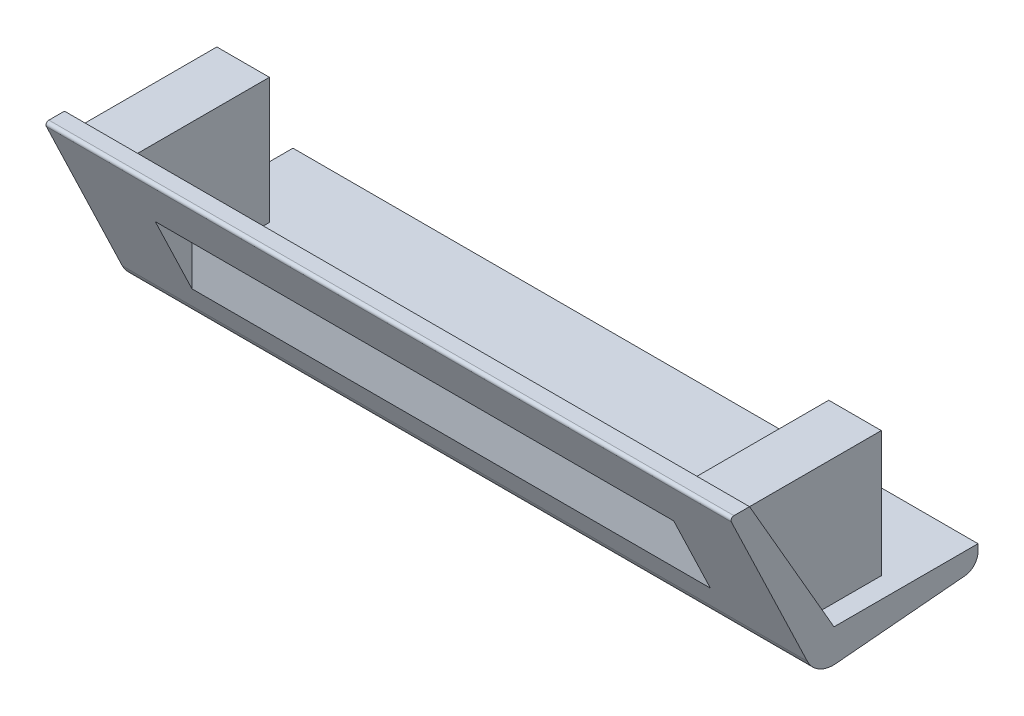
ISO-10303-21;
HEADER;
FILE_DESCRIPTION(('STEP AP214'),'2;1');
FILE_NAME('part.step','',(''),(''),'','','');
FILE_SCHEMA(('AUTOMOTIVE_DESIGN { 1 0 10303 214 1 1 1 1 }'));
ENDSEC;
DATA;
#1=APPLICATION_CONTEXT('core data for automotive mechanical design processes');
#2=APPLICATION_PROTOCOL_DEFINITION('international standard','automotive_design',2000,#1);
#3=PRODUCT_CONTEXT('',#1,'mechanical');
#4=PRODUCT('Part','Part','',(#3));
#5=PRODUCT_RELATED_PRODUCT_CATEGORY('part','',(#4));
#6=PRODUCT_DEFINITION_FORMATION('','',#4);
#7=PRODUCT_DEFINITION_CONTEXT('part definition',#1,'design');
#8=PRODUCT_DEFINITION('design','',#6,#7);
#9=PRODUCT_DEFINITION_SHAPE('','',#8);
#10=(LENGTH_UNIT() NAMED_UNIT(*) SI_UNIT(.MILLI.,.METRE.));
#11=(NAMED_UNIT(*) PLANE_ANGLE_UNIT() SI_UNIT($,.RADIAN.));
#12=(NAMED_UNIT(*) SI_UNIT($,.STERADIAN.) SOLID_ANGLE_UNIT());
#13=UNCERTAINTY_MEASURE_WITH_UNIT(LENGTH_MEASURE(1.E-05),#10,'distance_accuracy_value','');
#14=(GEOMETRIC_REPRESENTATION_CONTEXT(3) GLOBAL_UNCERTAINTY_ASSIGNED_CONTEXT((#13)) GLOBAL_UNIT_ASSIGNED_CONTEXT((#10,
#11,#12)) REPRESENTATION_CONTEXT('',''));
#15=CARTESIAN_POINT('',(0.,0.,0.));
#16=DIRECTION('',(0.,0.,1.));
#17=DIRECTION('',(1.,0.,0.));
#18=AXIS2_PLACEMENT_3D('',#15,#16,#17);
#19=CARTESIAN_POINT('',(118.925,0.,0.));
#20=DIRECTION('',(0.,-0.500000000000004,0.866025403784436));
#21=DIRECTION('',(0.,-0.866025403784436,-0.500000000000004));
#22=AXIS2_PLACEMENT_3D('',#19,#20,#21);
#23=PLANE('',#22);
#24=DIRECTION('',(0.,0.866025403784436,0.500000000000004));
#25=VECTOR('',#24,1.);
#26=CARTESIAN_POINT('',(-118.925,0.,0.));
#27=LINE('',#26,#25);
#28=CARTESIAN_POINT('',(-118.925,0.,0.));
#29=VERTEX_POINT('',#28);
#30=CARTESIAN_POINT('',(-118.925,50.8,29.3293936748333));
#31=VERTEX_POINT('',#30);
#32=EDGE_CURVE('E313',#29,#31,#27,.T.);
#33=ORIENTED_EDGE('',*,*,#32,.T.);
#34=DIRECTION('',(-1.,0.,0.));
#35=VECTOR('',#34,1.);
#36=CARTESIAN_POINT('',(118.925,50.8,29.3293936748333));
#37=LINE('',#36,#35);
#38=CARTESIAN_POINT('',(118.925,50.8,29.3293936748333));
#39=VERTEX_POINT('',#38);
#40=EDGE_CURVE('E325',#39,#31,#37,.T.);
#41=ORIENTED_EDGE('',*,*,#40,.F.);
#42=DIRECTION('',(0.,0.866025403784436,0.500000000000004));
#43=VECTOR('',#42,1.);
#44=CARTESIAN_POINT('',(118.925,0.,0.));
#45=LINE('',#44,#43);
#46=CARTESIAN_POINT('',(118.925,0.,0.));
#47=VERTEX_POINT('',#46);
#48=EDGE_CURVE('E298',#47,#39,#45,.T.);
#49=ORIENTED_EDGE('',*,*,#48,.F.);
#50=DIRECTION('',(-1.,0.,0.));
#51=VECTOR('',#50,1.);
#52=CARTESIAN_POINT('',(118.925,0.,0.));
#53=LINE('',#52,#51);
#54=EDGE_CURVE('E328',#47,#29,#53,.T.);
#55=ORIENTED_EDGE('',*,*,#54,.T.);
#56=EDGE_LOOP('',(#33,#41,#49,#55));
#57=FACE_BOUND('',#56,.T.);
#58=DIRECTION('',(0.,0.866025403784436,0.500000000000004));
#59=VECTOR('',#58,1.);
#60=CARTESIAN_POINT('',(115.35,63.8398995748694,36.8579832045899));
#61=LINE('',#60,#59);
#62=CARTESIAN_POINT('',(115.35,3.575,2.06402721235294));
#63=VERTEX_POINT('',#62);
#64=CARTESIAN_POINT('',(115.35,47.225,27.2653664624804));
#65=VERTEX_POINT('',#64);
#66=EDGE_CURVE('E253',#63,#65,#61,.T.);
#67=ORIENTED_EDGE('',*,*,#66,.T.);
#68=DIRECTION('',(-1.,0.,0.));
#69=VECTOR('',#68,1.);
#70=CARTESIAN_POINT('',(115.35,47.225,27.2653664624804));
#71=LINE('',#70,#69);
#72=CARTESIAN_POINT('',(97.1,47.225,27.2653664624804));
#73=VERTEX_POINT('',#72);
#74=EDGE_CURVE('E269',#65,#73,#71,.T.);
#75=ORIENTED_EDGE('',*,*,#74,.T.);
#76=DIRECTION('',(0.,-0.866025403784436,-0.500000000000004));
#77=VECTOR('',#76,1.);
#78=CARTESIAN_POINT('',(97.1,63.8398995748694,36.8579832045899));
#79=LINE('',#78,#77);
#80=CARTESIAN_POINT('',(97.1,3.575,2.06402721235294));
#81=VERTEX_POINT('',#80);
#82=EDGE_CURVE('E266',#73,#81,#79,.T.);
#83=ORIENTED_EDGE('',*,*,#82,.T.);
#84=DIRECTION('',(1.,0.,0.));
#85=VECTOR('',#84,1.);
#86=CARTESIAN_POINT('',(115.35,3.575,2.06402721235294));
#87=LINE('',#86,#85);
#88=EDGE_CURVE('E262',#81,#63,#87,.T.);
#89=ORIENTED_EDGE('',*,*,#88,.T.);
#90=EDGE_LOOP('',(#67,#75,#83,#89));
#91=FACE_BOUND('',#90,.T.);
#92=DIRECTION('',(1.,0.,0.));
#93=VECTOR('',#92,1.);
#94=CARTESIAN_POINT('',(-115.35,3.575,2.06402721235294));
#95=LINE('',#94,#93);
#96=CARTESIAN_POINT('',(-115.35,3.575,2.06402721235294));
#97=VERTEX_POINT('',#96);
#98=CARTESIAN_POINT('',(-97.1,3.575,2.06402721235294));
#99=VERTEX_POINT('',#98);
#100=EDGE_CURVE('E250',#97,#99,#95,.T.);
#101=ORIENTED_EDGE('',*,*,#100,.T.);
#102=DIRECTION('',(0.,0.866025403784436,0.500000000000004));
#103=VECTOR('',#102,1.);
#104=CARTESIAN_POINT('',(-97.1,63.8398995748694,36.8579832045899));
#105=LINE('',#104,#103);
#106=CARTESIAN_POINT('',(-97.1,47.225,27.2653664624804));
#107=VERTEX_POINT('',#106);
#108=EDGE_CURVE('E254',#99,#107,#105,.T.);
#109=ORIENTED_EDGE('',*,*,#108,.T.);
#110=DIRECTION('',(-1.,0.,0.));
#111=VECTOR('',#110,1.);
#112=CARTESIAN_POINT('',(-115.35,47.225,27.2653664624804));
#113=LINE('',#112,#111);
#114=CARTESIAN_POINT('',(-115.35,47.225,27.2653664624804));
#115=VERTEX_POINT('',#114);
#116=EDGE_CURVE('E257',#107,#115,#113,.T.);
#117=ORIENTED_EDGE('',*,*,#116,.T.);
#118=DIRECTION('',(0.,-0.866025403784436,-0.500000000000004));
#119=VECTOR('',#118,1.);
#120=CARTESIAN_POINT('',(-115.35,63.8398995748694,36.8579832045899));
#121=LINE('',#120,#119);
#122=EDGE_CURVE('E249',#115,#97,#121,.T.);
#123=ORIENTED_EDGE('',*,*,#122,.T.);
#124=EDGE_LOOP('',(#101,#109,#117,#123));
#125=FACE_BOUND('',#124,.T.);
#126=DIRECTION('',(0.,0.866025403784438,0.5));
#127=VECTOR('',#126,1.);
#128=CARTESIAN_POINT('',(-90.,34.6410161513775,20.));
#129=LINE('',#128,#127);
#130=CARTESIAN_POINT('',(-90.,24.2487113059643,14.));
#131=VERTEX_POINT('',#130);
#132=CARTESIAN_POINT('',(-90.,34.6410161513775,20.));
#133=VERTEX_POINT('',#132);
#134=EDGE_CURVE('E203',#131,#133,#129,.T.);
#135=ORIENTED_EDGE('',*,*,#134,.F.);
#136=DIRECTION('',(1.,0.,0.));
#137=VECTOR('',#136,1.);
#138=CARTESIAN_POINT('',(-90.,24.2487113059643,14.));
#139=LINE('',#138,#137);
#140=CARTESIAN_POINT('',(90.,24.2487113059643,14.));
#141=VERTEX_POINT('',#140);
#142=EDGE_CURVE('E186',#131,#141,#139,.T.);
#143=ORIENTED_EDGE('',*,*,#142,.T.);
#144=DIRECTION('',(0.,0.866025403784438,0.5));
#145=VECTOR('',#144,1.);
#146=CARTESIAN_POINT('',(90.,34.6410161513775,20.));
#147=LINE('',#146,#145);
#148=CARTESIAN_POINT('',(90.,34.6410161513775,20.0000000000002));
#149=VERTEX_POINT('',#148);
#150=EDGE_CURVE('E216',#141,#149,#147,.T.);
#151=ORIENTED_EDGE('',*,*,#150,.T.);
#152=DIRECTION('',(1.,0.,0.));
#153=VECTOR('',#152,1.);
#154=CARTESIAN_POINT('',(-90.,34.6410161513775,20.));
#155=LINE('',#154,#153);
#156=EDGE_CURVE('E196',#133,#149,#155,.T.);
#157=ORIENTED_EDGE('',*,*,#156,.F.);
#158=EDGE_LOOP('',(#135,#143,#151,#157));
#159=FACE_BOUND('',#158,.T.);
#160=ADVANCED_FACE('F43',(#57,#91,#125,#159),#23,.F.);
#161=CARTESIAN_POINT('',(118.925,50.8,36.3293936748333));
#162=DIRECTION('',(0.,0.431942964846679,-0.901900923117091));
#163=DIRECTION('',(0.,0.901900923117091,0.431942964846679));
#164=AXIS2_PLACEMENT_3D('',#161,#162,#163);
#165=PLANE('',#164);
#166=DIRECTION('',(0.,-0.901900923117091,-0.431942964846679));
#167=VECTOR('',#166,1.);
#168=CARTESIAN_POINT('',(118.925,50.8,36.3293936748333));
#169=LINE('',#168,#167);
#170=CARTESIAN_POINT('',(118.925,49.3680570351533,35.6436002868085));
#171=VERTEX_POINT('',#170);
#172=CARTESIAN_POINT('',(118.925,-5.74464077775887,9.24874749994889));
#173=VERTEX_POINT('',#172);
#174=EDGE_CURVE('E303',#171,#173,#169,.T.);
#175=ORIENTED_EDGE('',*,*,#174,.F.);
#176=DIRECTION('',(-1.,0.,0.));
#177=VECTOR('',#176,1.);
#178=CARTESIAN_POINT('',(118.925,49.3680570351533,35.6436002868085));
#179=LINE('',#178,#177);
#180=CARTESIAN_POINT('',(-118.925,49.3680570351533,35.6436002868085));
#181=VERTEX_POINT('',#180);
#182=EDGE_CURVE('E351',#171,#181,#179,.T.);
#183=ORIENTED_EDGE('',*,*,#182,.T.);
#184=DIRECTION('',(0.,-0.901900923117091,-0.431942964846679));
#185=VECTOR('',#184,1.);
#186=CARTESIAN_POINT('',(-118.925,50.8,36.3293936748333));
#187=LINE('',#186,#185);
#188=CARTESIAN_POINT('',(-118.925,-5.74464077775887,9.24874749994889));
#189=VERTEX_POINT('',#188);
#190=EDGE_CURVE('E317',#181,#189,#187,.T.);
#191=ORIENTED_EDGE('',*,*,#190,.T.);
#192=DIRECTION('',(-1.,0.,0.));
#193=VECTOR('',#192,1.);
#194=CARTESIAN_POINT('',(118.925,-5.74464077775889,9.24874749994888));
#195=LINE('',#194,#193);
#196=EDGE_CURVE('E337',#189,#173,#195,.F.);
#197=ORIENTED_EDGE('',*,*,#196,.T.);
#198=EDGE_LOOP('',(#175,#183,#191,#197));
#199=FACE_BOUND('',#198,.T.);
#200=DIRECTION('',(0.,-0.901900923117091,-0.431942964846679));
#201=VECTOR('',#200,1.);
#202=CARTESIAN_POINT('',(-90.,30.7556498548623,26.7296518315802));
#203=LINE('',#202,#201);
#204=CARTESIAN_POINT('',(-90.,30.7556498548623,26.7296518315802));
#205=VERTEX_POINT('',#204);
#206=CARTESIAN_POINT('',(-90.,4.17601857892154,14.));
#207=VERTEX_POINT('',#206);
#208=EDGE_CURVE('E197',#205,#207,#203,.T.);
#209=ORIENTED_EDGE('',*,*,#208,.F.);
#210=DIRECTION('',(1.,0.,0.));
#211=VECTOR('',#210,1.);
#212=CARTESIAN_POINT('',(-90.,30.7556498548623,26.7296518315802));
#213=LINE('',#212,#211);
#214=CARTESIAN_POINT('',(90.,30.7556498548623,26.7296518315802));
#215=VERTEX_POINT('',#214);
#216=EDGE_CURVE('E225',#205,#215,#213,.T.);
#217=ORIENTED_EDGE('',*,*,#216,.T.);
#218=DIRECTION('',(0.,-0.901900923117091,-0.431942964846679));
#219=VECTOR('',#218,1.);
#220=CARTESIAN_POINT('',(90.,30.7556498548623,26.7296518315802));
#221=LINE('',#220,#219);
#222=CARTESIAN_POINT('',(90.,4.17601857892153,14.));
#223=VERTEX_POINT('',#222);
#224=EDGE_CURVE('E207',#215,#223,#221,.T.);
#225=ORIENTED_EDGE('',*,*,#224,.T.);
#226=DIRECTION('',(1.,0.,0.));
#227=VECTOR('',#226,1.);
#228=CARTESIAN_POINT('',(-90.,4.17601857892154,14.));
#229=LINE('',#228,#227);
#230=EDGE_CURVE('E222',#207,#223,#229,.T.);
#231=ORIENTED_EDGE('',*,*,#230,.F.);
#232=EDGE_LOOP('',(#209,#217,#225,#231));
#233=FACE_BOUND('',#232,.T.);
#234=ADVANCED_FACE('F357',(#199,#233),#165,.F.);
#235=CARTESIAN_POINT('',(118.925,0.,0.));
#236=DIRECTION('',(0.,-1.,0.));
#237=DIRECTION('',(0.,0.,-1.));
#238=AXIS2_PLACEMENT_3D('',#235,#236,#237);
#239=PLANE('',#238);
#240=DIRECTION('',(0.,0.,1.));
#241=VECTOR('',#240,1.);
#242=CARTESIAN_POINT('',(-118.925,0.,0.));
#243=LINE('',#242,#241);
#244=CARTESIAN_POINT('',(-118.925,0.,-50.));
#245=VERTEX_POINT('',#244);
#246=EDGE_CURVE('E288',#245,#29,#243,.T.);
#247=ORIENTED_EDGE('',*,*,#246,.T.);
#248=ORIENTED_EDGE('',*,*,#54,.F.);
#249=DIRECTION('',(0.,0.,1.));
#250=VECTOR('',#249,1.);
#251=CARTESIAN_POINT('',(118.925,0.,0.));
#252=LINE('',#251,#250);
#253=CARTESIAN_POINT('',(118.925,0.,-50.));
#254=VERTEX_POINT('',#253);
#255=EDGE_CURVE('E295',#254,#47,#252,.T.);
#256=ORIENTED_EDGE('',*,*,#255,.F.);
#257=DIRECTION('',(-1.,0.,0.));
#258=VECTOR('',#257,1.);
#259=CARTESIAN_POINT('',(118.925,0.,-50.));
#260=LINE('',#259,#258);
#261=EDGE_CURVE('E310',#254,#245,#260,.T.);
#262=ORIENTED_EDGE('',*,*,#261,.T.);
#263=EDGE_LOOP('',(#247,#248,#256,#262));
#264=FACE_BOUND('',#263,.T.);
#265=ADVANCED_FACE('F387',(#264),#239,.F.);
#266=CARTESIAN_POINT('',(118.925,50.8,29.3293936748333));
#267=DIRECTION('',(0.,-1.,0.));
#268=DIRECTION('',(0.,0.,-1.));
#269=AXIS2_PLACEMENT_3D('',#266,#267,#268);
#270=PLANE('',#269);
#271=DIRECTION('',(0.,0.,1.));
#272=VECTOR('',#271,1.);
#273=CARTESIAN_POINT('',(-118.925,50.8,29.3293936748333));
#274=LINE('',#273,#272);
#275=CARTESIAN_POINT('',(-118.925,50.8,34.7416993636914));
#276=VERTEX_POINT('',#275);
#277=EDGE_CURVE('E315',#31,#276,#274,.T.);
#278=ORIENTED_EDGE('',*,*,#277,.T.);
#279=DIRECTION('',(-1.,0.,0.));
#280=VECTOR('',#279,1.);
#281=CARTESIAN_POINT('',(118.925,50.8,34.7416993636914));
#282=LINE('',#281,#280);
#283=CARTESIAN_POINT('',(118.925,50.8,34.7416993636914));
#284=VERTEX_POINT('',#283);
#285=EDGE_CURVE('E51',#276,#284,#282,.F.);
#286=ORIENTED_EDGE('',*,*,#285,.T.);
#287=DIRECTION('',(0.,0.,1.));
#288=VECTOR('',#287,1.);
#289=CARTESIAN_POINT('',(118.925,50.8,29.3293936748333));
#290=LINE('',#289,#288);
#291=EDGE_CURVE('E301',#39,#284,#290,.T.);
#292=ORIENTED_EDGE('',*,*,#291,.F.);
#293=ORIENTED_EDGE('',*,*,#40,.T.);
#294=EDGE_LOOP('',(#278,#286,#292,#293));
#295=FACE_BOUND('',#294,.T.);
#296=ADVANCED_FACE('F391',(#295),#270,.F.);
#297=CARTESIAN_POINT('',(118.925,-12.,6.25289913192913));
#298=DIRECTION('',(0.,0.996073043113218,0.0885352629361504));
#299=DIRECTION('',(0.,-0.0885352629361504,0.996073043113218));
#300=AXIS2_PLACEMENT_3D('',#297,#298,#299);
#301=PLANE('',#300);
#302=DIRECTION('',(0.,0.0885352629361504,-0.996073043113218));
#303=VECTOR('',#302,1.);
#304=CARTESIAN_POINT('',(-118.925,-12.,6.25289913192913));
#305=LINE('',#304,#303);
#306=CARTESIAN_POINT('',(-118.925,-11.3859415604243,-0.655614360583529));
#307=VERTEX_POINT('',#306);
#308=CARTESIAN_POINT('',(-118.925,-7.40507456110227,-45.4426763146808));
#309=VERTEX_POINT('',#308);
#310=EDGE_CURVE('E319',#307,#309,#305,.T.);
#311=ORIENTED_EDGE('',*,*,#310,.T.);
#312=DIRECTION('',(-1.,0.,0.));
#313=VECTOR('',#312,1.);
#314=CARTESIAN_POINT('',(118.925,-7.40507456110227,-45.4426763146807));
#315=LINE('',#314,#313);
#316=CARTESIAN_POINT('',(118.925,-7.40507456110227,-45.4426763146808));
#317=VERTEX_POINT('',#316);
#318=EDGE_CURVE('E347',#309,#317,#315,.F.);
#319=ORIENTED_EDGE('',*,*,#318,.T.);
#320=DIRECTION('',(0.,0.0885352629361504,-0.996073043113218));
#321=VECTOR('',#320,1.);
#322=CARTESIAN_POINT('',(118.925,-12.,6.25289913192913));
#323=LINE('',#322,#321);
#324=CARTESIAN_POINT('',(118.925,-11.3859415604243,-0.655614360583529));
#325=VERTEX_POINT('',#324);
#326=EDGE_CURVE('E305',#325,#317,#323,.T.);
#327=ORIENTED_EDGE('',*,*,#326,.F.);
#328=DIRECTION('',(-1.,0.,0.));
#329=VECTOR('',#328,1.);
#330=CARTESIAN_POINT('',(118.925,-11.3859415604243,-0.655614360583528));
#331=LINE('',#330,#329);
#332=EDGE_CURVE('E331',#325,#307,#331,.T.);
#333=ORIENTED_EDGE('',*,*,#332,.T.);
#334=EDGE_LOOP('',(#311,#319,#327,#333));
#335=FACE_BOUND('',#334,.T.);
#336=ADVANCED_FACE('F373',(#335),#301,.F.);
#337=CARTESIAN_POINT('',(118.925,-7.,-50.));
#338=DIRECTION('',(0.,0.,1.));
#339=DIRECTION('',(1.,0.,0.));
#340=AXIS2_PLACEMENT_3D('',#337,#338,#339);
#341=PLANE('',#340);
#342=DIRECTION('',(0.,1.,0.));
#343=VECTOR('',#342,1.);
#344=CARTESIAN_POINT('',(118.925,-7.,-50.));
#345=LINE('',#344,#343);
#346=CARTESIAN_POINT('',(118.925,-2.42470934553617,-50.));
#347=VERTEX_POINT('',#346);
#348=EDGE_CURVE('E308',#347,#254,#345,.T.);
#349=ORIENTED_EDGE('',*,*,#348,.F.);
#350=DIRECTION('',(-1.,0.,0.));
#351=VECTOR('',#350,1.);
#352=CARTESIAN_POINT('',(118.925,-2.42470934553617,-50.));
#353=LINE('',#352,#351);
#354=CARTESIAN_POINT('',(-118.925,-2.42470934553617,-50.));
#355=VERTEX_POINT('',#354);
#356=EDGE_CURVE('E342',#347,#355,#353,.T.);
#357=ORIENTED_EDGE('',*,*,#356,.T.);
#358=DIRECTION('',(0.,1.,0.));
#359=VECTOR('',#358,1.);
#360=CARTESIAN_POINT('',(-118.925,-7.,-50.));
#361=LINE('',#360,#359);
#362=EDGE_CURVE('E299',#355,#245,#361,.T.);
#363=ORIENTED_EDGE('',*,*,#362,.T.);
#364=ORIENTED_EDGE('',*,*,#261,.F.);
#365=EDGE_LOOP('',(#349,#357,#363,#364));
#366=FACE_BOUND('',#365,.T.);
#367=ADVANCED_FACE('F381',(#366),#341,.F.);
#368=CARTESIAN_POINT('',(118.925,0.,0.));
#369=DIRECTION('',(1.,0.,0.));
#370=DIRECTION('',(0.,0.,-1.));
#371=AXIS2_PLACEMENT_3D('',#368,#369,#370);
#372=PLANE('',#371);
#373=ORIENTED_EDGE('',*,*,#291,.T.);
#374=CARTESIAN_POINT('',(118.925,49.8,34.7416993636914));
#375=DIRECTION('',(1.,0.,0.));
#376=DIRECTION('',(0.,0.,-1.));
#377=AXIS2_PLACEMENT_3D('',#374,#375,#376);
#378=CIRCLE('',#377,1.);
#379=EDGE_CURVE('E11',#284,#171,#378,.T.);
#380=ORIENTED_EDGE('',*,*,#379,.T.);
#381=ORIENTED_EDGE('',*,*,#174,.T.);
#382=CARTESIAN_POINT('',(118.925,-1.42521112929209,0.229738268777976));
#383=DIRECTION('',(1.,0.,0.));
#384=DIRECTION('',(0.,0.,-1.));
#385=AXIS2_PLACEMENT_3D('',#382,#383,#384);
#386=CIRCLE('',#385,10.);
#387=EDGE_CURVE('E340',#173,#325,#386,.T.);
#388=ORIENTED_EDGE('',*,*,#387,.T.);
#389=ORIENTED_EDGE('',*,*,#326,.T.);
#390=CARTESIAN_POINT('',(118.925,-2.42470934553617,-45.));
#391=DIRECTION('',(1.,0.,0.));
#392=DIRECTION('',(0.,0.,-1.));
#393=AXIS2_PLACEMENT_3D('',#390,#391,#392);
#394=CIRCLE('',#393,5.);
#395=EDGE_CURVE('E349',#317,#347,#394,.T.);
#396=ORIENTED_EDGE('',*,*,#395,.T.);
#397=ORIENTED_EDGE('',*,*,#348,.T.);
#398=ORIENTED_EDGE('',*,*,#255,.T.);
#399=ORIENTED_EDGE('',*,*,#48,.T.);
#400=EDGE_LOOP('',(#373,#380,#381,#388,#389,#396,#397,#398,#399));
#401=FACE_BOUND('',#400,.T.);
#402=ADVANCED_FACE('F370',(#401),#372,.T.);
#403=CARTESIAN_POINT('',(-118.925,0.,0.));
#404=DIRECTION('',(1.,0.,0.));
#405=DIRECTION('',(0.,0.,-1.));
#406=AXIS2_PLACEMENT_3D('',#403,#404,#405);
#407=PLANE('',#406);
#408=ORIENTED_EDGE('',*,*,#190,.F.);
#409=CARTESIAN_POINT('',(-118.925,49.8,34.7416993636914));
#410=DIRECTION('',(1.,0.,0.));
#411=DIRECTION('',(0.,0.,-1.));
#412=AXIS2_PLACEMENT_3D('',#409,#410,#411);
#413=CIRCLE('',#412,1.);
#414=EDGE_CURVE('E65',#181,#276,#413,.F.);
#415=ORIENTED_EDGE('',*,*,#414,.T.);
#416=ORIENTED_EDGE('',*,*,#277,.F.);
#417=ORIENTED_EDGE('',*,*,#32,.F.);
#418=ORIENTED_EDGE('',*,*,#246,.F.);
#419=ORIENTED_EDGE('',*,*,#362,.F.);
#420=CARTESIAN_POINT('',(-118.925,-2.42470934553617,-45.));
#421=DIRECTION('',(1.,0.,0.));
#422=DIRECTION('',(0.,0.,-1.));
#423=AXIS2_PLACEMENT_3D('',#420,#421,#422);
#424=CIRCLE('',#423,5.);
#425=EDGE_CURVE('E345',#355,#309,#424,.F.);
#426=ORIENTED_EDGE('',*,*,#425,.T.);
#427=ORIENTED_EDGE('',*,*,#310,.F.);
#428=CARTESIAN_POINT('',(-118.925,-1.42521112929209,0.229738268777976));
#429=DIRECTION('',(1.,0.,0.));
#430=DIRECTION('',(0.,0.,-1.));
#431=AXIS2_PLACEMENT_3D('',#428,#429,#430);
#432=CIRCLE('',#431,10.);
#433=EDGE_CURVE('E334',#307,#189,#432,.F.);
#434=ORIENTED_EDGE('',*,*,#433,.T.);
#435=EDGE_LOOP('',(#408,#415,#416,#417,#418,#419,#426,#427,#434));
#436=FACE_BOUND('',#435,.T.);
#437=ADVANCED_FACE('F361',(#436),#407,.F.);
#438=CARTESIAN_POINT('',(115.35,47.225,-20.));
#439=DIRECTION('',(0.,1.,0.));
#440=DIRECTION('',(0.,0.,1.));
#441=AXIS2_PLACEMENT_3D('',#438,#439,#440);
#442=PLANE('',#441);
#443=DIRECTION('',(0.,0.,1.));
#444=VECTOR('',#443,1.);
#445=CARTESIAN_POINT('',(97.1,47.225,-20.));
#446=LINE('',#445,#444);
#447=CARTESIAN_POINT('',(97.1,47.225,-20.));
#448=VERTEX_POINT('',#447);
#449=EDGE_CURVE('E285',#448,#73,#446,.T.);
#450=ORIENTED_EDGE('',*,*,#449,.T.);
#451=ORIENTED_EDGE('',*,*,#74,.F.);
#452=DIRECTION('',(0.,0.,1.));
#453=VECTOR('',#452,1.);
#454=CARTESIAN_POINT('',(115.35,47.225,-20.));
#455=LINE('',#454,#453);
#456=CARTESIAN_POINT('',(115.35,47.225,-20.));
#457=VERTEX_POINT('',#456);
#458=EDGE_CURVE('E286',#457,#65,#455,.T.);
#459=ORIENTED_EDGE('',*,*,#458,.F.);
#460=DIRECTION('',(-1.,0.,0.));
#461=VECTOR('',#460,1.);
#462=CARTESIAN_POINT('',(115.35,47.225,-20.));
#463=LINE('',#462,#461);
#464=EDGE_CURVE('E265',#457,#448,#463,.T.);
#465=ORIENTED_EDGE('',*,*,#464,.T.);
#466=EDGE_LOOP('',(#450,#451,#459,#465));
#467=FACE_BOUND('',#466,.T.);
#468=ADVANCED_FACE('F425',(#467),#442,.T.);
#469=CARTESIAN_POINT('',(115.35,47.225,-20.));
#470=DIRECTION('',(1.,0.,0.));
#471=DIRECTION('',(0.,0.,-1.));
#472=AXIS2_PLACEMENT_3D('',#469,#470,#471);
#473=PLANE('',#472);
#474=ORIENTED_EDGE('',*,*,#458,.T.);
#475=ORIENTED_EDGE('',*,*,#66,.F.);
#476=DIRECTION('',(0.,0.,1.));
#477=VECTOR('',#476,1.);
#478=CARTESIAN_POINT('',(115.35,3.575,-20.));
#479=LINE('',#478,#477);
#480=CARTESIAN_POINT('',(115.35,3.575,-20.));
#481=VERTEX_POINT('',#480);
#482=EDGE_CURVE('E289',#481,#63,#479,.T.);
#483=ORIENTED_EDGE('',*,*,#482,.F.);
#484=DIRECTION('',(0.,1.,0.));
#485=VECTOR('',#484,1.);
#486=CARTESIAN_POINT('',(115.35,47.225,-20.));
#487=LINE('',#486,#485);
#488=EDGE_CURVE('E282',#481,#457,#487,.T.);
#489=ORIENTED_EDGE('',*,*,#488,.T.);
#490=EDGE_LOOP('',(#474,#475,#483,#489));
#491=FACE_BOUND('',#490,.T.);
#492=ADVANCED_FACE('F466',(#491),#473,.T.);
#493=CARTESIAN_POINT('',(115.35,3.575,-20.));
#494=DIRECTION('',(0.,-1.,0.));
#495=DIRECTION('',(1.,0.,0.));
#496=AXIS2_PLACEMENT_3D('',#493,#494,#495);
#497=PLANE('',#496);
#498=ORIENTED_EDGE('',*,*,#482,.T.);
#499=ORIENTED_EDGE('',*,*,#88,.F.);
#500=DIRECTION('',(0.,0.,1.));
#501=VECTOR('',#500,1.);
#502=CARTESIAN_POINT('',(97.1,3.575,-20.));
#503=LINE('',#502,#501);
#504=CARTESIAN_POINT('',(97.1,3.575,-20.));
#505=VERTEX_POINT('',#504);
#506=EDGE_CURVE('E291',#505,#81,#503,.T.);
#507=ORIENTED_EDGE('',*,*,#506,.F.);
#508=DIRECTION('',(1.,0.,0.));
#509=VECTOR('',#508,1.);
#510=CARTESIAN_POINT('',(115.35,3.575,-20.));
#511=LINE('',#510,#509);
#512=EDGE_CURVE('E279',#505,#481,#511,.T.);
#513=ORIENTED_EDGE('',*,*,#512,.T.);
#514=EDGE_LOOP('',(#498,#499,#507,#513));
#515=FACE_BOUND('',#514,.T.);
#516=ADVANCED_FACE('F478',(#515),#497,.T.);
#517=CARTESIAN_POINT('',(97.1,47.225,-20.));
#518=DIRECTION('',(-1.,0.,0.));
#519=DIRECTION('',(0.,0.,1.));
#520=AXIS2_PLACEMENT_3D('',#517,#518,#519);
#521=PLANE('',#520);
#522=ORIENTED_EDGE('',*,*,#506,.T.);
#523=ORIENTED_EDGE('',*,*,#82,.F.);
#524=ORIENTED_EDGE('',*,*,#449,.F.);
#525=DIRECTION('',(0.,-1.,0.));
#526=VECTOR('',#525,1.);
#527=CARTESIAN_POINT('',(97.1,47.225,-20.));
#528=LINE('',#527,#526);
#529=EDGE_CURVE('E276',#448,#505,#528,.T.);
#530=ORIENTED_EDGE('',*,*,#529,.T.);
#531=EDGE_LOOP('',(#522,#523,#524,#530));
#532=FACE_BOUND('',#531,.T.);
#533=ADVANCED_FACE('F490',(#532),#521,.T.);
#534=CARTESIAN_POINT('',(0.,0.,-20.));
#535=DIRECTION('',(0.,0.,1.));
#536=DIRECTION('',(1.,0.,0.));
#537=AXIS2_PLACEMENT_3D('',#534,#535,#536);
#538=PLANE('',#537);
#539=ORIENTED_EDGE('',*,*,#464,.F.);
#540=ORIENTED_EDGE('',*,*,#488,.F.);
#541=ORIENTED_EDGE('',*,*,#512,.F.);
#542=ORIENTED_EDGE('',*,*,#529,.F.);
#543=EDGE_LOOP('',(#539,#540,#541,#542));
#544=FACE_BOUND('',#543,.T.);
#545=ADVANCED_FACE('F502',(#544),#538,.F.);
#546=CARTESIAN_POINT('',(-97.1,47.225,-20.));
#547=DIRECTION('',(1.,0.,0.));
#548=DIRECTION('',(0.,0.,-1.));
#549=AXIS2_PLACEMENT_3D('',#546,#547,#548);
#550=PLANE('',#549);
#551=DIRECTION('',(0.,0.,1.));
#552=VECTOR('',#551,1.);
#553=CARTESIAN_POINT('',(-97.1,47.225,-20.));
#554=LINE('',#553,#552);
#555=CARTESIAN_POINT('',(-97.1,47.225,-20.));
#556=VERTEX_POINT('',#555);
#557=EDGE_CURVE('E229',#556,#107,#554,.T.);
#558=ORIENTED_EDGE('',*,*,#557,.T.);
#559=ORIENTED_EDGE('',*,*,#108,.F.);
#560=DIRECTION('',(0.,0.,1.));
#561=VECTOR('',#560,1.);
#562=CARTESIAN_POINT('',(-97.1,3.575,-20.));
#563=LINE('',#562,#561);
#564=CARTESIAN_POINT('',(-97.1,3.575,-20.));
#565=VERTEX_POINT('',#564);
#566=EDGE_CURVE('E224',#565,#99,#563,.T.);
#567=ORIENTED_EDGE('',*,*,#566,.F.);
#568=DIRECTION('',(0.,1.,0.));
#569=VECTOR('',#568,1.);
#570=CARTESIAN_POINT('',(-97.1,47.225,-20.));
#571=LINE('',#570,#569);
#572=EDGE_CURVE('E246',#565,#556,#571,.T.);
#573=ORIENTED_EDGE('',*,*,#572,.T.);
#574=EDGE_LOOP('',(#558,#559,#567,#573));
#575=FACE_BOUND('',#574,.T.);
#576=ADVANCED_FACE('F514',(#575),#550,.T.);
#577=CARTESIAN_POINT('',(-115.35,3.575,-20.));
#578=DIRECTION('',(0.,-1.,0.));
#579=DIRECTION('',(1.,0.,0.));
#580=AXIS2_PLACEMENT_3D('',#577,#578,#579);
#581=PLANE('',#580);
#582=ORIENTED_EDGE('',*,*,#566,.T.);
#583=ORIENTED_EDGE('',*,*,#100,.F.);
#584=DIRECTION('',(0.,0.,1.));
#585=VECTOR('',#584,1.);
#586=CARTESIAN_POINT('',(-115.35,3.575,-20.));
#587=LINE('',#586,#585);
#588=CARTESIAN_POINT('',(-115.35,3.575,-20.));
#589=VERTEX_POINT('',#588);
#590=EDGE_CURVE('E235',#589,#97,#587,.T.);
#591=ORIENTED_EDGE('',*,*,#590,.F.);
#592=DIRECTION('',(1.,0.,0.));
#593=VECTOR('',#592,1.);
#594=CARTESIAN_POINT('',(-115.35,3.575,-20.));
#595=LINE('',#594,#593);
#596=EDGE_CURVE('E231',#589,#565,#595,.T.);
#597=ORIENTED_EDGE('',*,*,#596,.T.);
#598=EDGE_LOOP('',(#582,#583,#591,#597));
#599=FACE_BOUND('',#598,.T.);
#600=ADVANCED_FACE('F526',(#599),#581,.T.);
#601=CARTESIAN_POINT('',(-115.35,47.225,-20.));
#602=DIRECTION('',(-1.,0.,0.));
#603=DIRECTION('',(0.,0.,1.));
#604=AXIS2_PLACEMENT_3D('',#601,#602,#603);
#605=PLANE('',#604);
#606=ORIENTED_EDGE('',*,*,#590,.T.);
#607=ORIENTED_EDGE('',*,*,#122,.F.);
#608=DIRECTION('',(0.,0.,1.));
#609=VECTOR('',#608,1.);
#610=CARTESIAN_POINT('',(-115.35,47.225,-20.));
#611=LINE('',#610,#609);
#612=CARTESIAN_POINT('',(-115.35,47.225,-20.));
#613=VERTEX_POINT('',#612);
#614=EDGE_CURVE('E232',#613,#115,#611,.T.);
#615=ORIENTED_EDGE('',*,*,#614,.F.);
#616=DIRECTION('',(0.,-1.,0.));
#617=VECTOR('',#616,1.);
#618=CARTESIAN_POINT('',(-115.35,47.225,-20.));
#619=LINE('',#618,#617);
#620=EDGE_CURVE('E240',#613,#589,#619,.T.);
#621=ORIENTED_EDGE('',*,*,#620,.T.);
#622=EDGE_LOOP('',(#606,#607,#615,#621));
#623=FACE_BOUND('',#622,.T.);
#624=ADVANCED_FACE('F538',(#623),#605,.T.);
#625=CARTESIAN_POINT('',(-115.35,47.225,-20.));
#626=DIRECTION('',(0.,1.,0.));
#627=DIRECTION('',(0.,0.,1.));
#628=AXIS2_PLACEMENT_3D('',#625,#626,#627);
#629=PLANE('',#628);
#630=ORIENTED_EDGE('',*,*,#614,.T.);
#631=ORIENTED_EDGE('',*,*,#116,.F.);
#632=ORIENTED_EDGE('',*,*,#557,.F.);
#633=DIRECTION('',(-1.,0.,0.));
#634=VECTOR('',#633,1.);
#635=CARTESIAN_POINT('',(-115.35,47.225,-20.));
#636=LINE('',#635,#634);
#637=EDGE_CURVE('E243',#556,#613,#636,.T.);
#638=ORIENTED_EDGE('',*,*,#637,.T.);
#639=EDGE_LOOP('',(#630,#631,#632,#638));
#640=FACE_BOUND('',#639,.T.);
#641=ADVANCED_FACE('F550',(#640),#629,.T.);
#642=CARTESIAN_POINT('',(0.,0.,-20.));
#643=DIRECTION('',(0.,0.,1.));
#644=DIRECTION('',(1.,0.,0.));
#645=AXIS2_PLACEMENT_3D('',#642,#643,#644);
#646=PLANE('',#645);
#647=ORIENTED_EDGE('',*,*,#572,.F.);
#648=ORIENTED_EDGE('',*,*,#596,.F.);
#649=ORIENTED_EDGE('',*,*,#620,.F.);
#650=ORIENTED_EDGE('',*,*,#637,.F.);
#651=EDGE_LOOP('',(#647,#648,#649,#650));
#652=FACE_BOUND('',#651,.T.);
#653=ADVANCED_FACE('F561',(#652),#646,.F.);
#654=CARTESIAN_POINT('',(-90.,24.2487113059643,14.));
#655=DIRECTION('',(0.,0.,-1.));
#656=DIRECTION('',(0.,1.,0.));
#657=AXIS2_PLACEMENT_3D('',#654,#655,#656);
#658=PLANE('',#657);
#659=DIRECTION('',(0.,1.,0.));
#660=VECTOR('',#659,1.);
#661=CARTESIAN_POINT('',(90.,24.2487113059643,14.));
#662=LINE('',#661,#660);
#663=EDGE_CURVE('E192',#223,#141,#662,.T.);
#664=ORIENTED_EDGE('',*,*,#663,.T.);
#665=ORIENTED_EDGE('',*,*,#142,.F.);
#666=DIRECTION('',(0.,1.,0.));
#667=VECTOR('',#666,1.);
#668=CARTESIAN_POINT('',(-90.,24.2487113059643,14.));
#669=LINE('',#668,#667);
#670=EDGE_CURVE('E190',#207,#131,#669,.T.);
#671=ORIENTED_EDGE('',*,*,#670,.F.);
#672=ORIENTED_EDGE('',*,*,#230,.T.);
#673=EDGE_LOOP('',(#664,#665,#671,#672));
#674=FACE_BOUND('',#673,.T.);
#675=ADVANCED_FACE('F188',(#674),#658,.F.);
#676=CARTESIAN_POINT('',(-90.,30.7556498548623,26.7296518315802));
#677=DIRECTION('',(0.,0.866025403784439,0.5));
#678=DIRECTION('',(0.,-0.5,0.866025403784439));
#679=AXIS2_PLACEMENT_3D('',#676,#677,#678);
#680=PLANE('',#679);
#681=DIRECTION('',(0.,-0.5,0.866025403784438));
#682=VECTOR('',#681,1.);
#683=CARTESIAN_POINT('',(90.,30.7556498548623,26.7296518315802));
#684=LINE('',#683,#682);
#685=EDGE_CURVE('E218',#149,#215,#684,.T.);
#686=ORIENTED_EDGE('',*,*,#685,.T.);
#687=ORIENTED_EDGE('',*,*,#216,.F.);
#688=DIRECTION('',(0.,-0.5,0.866025403784438));
#689=VECTOR('',#688,1.);
#690=CARTESIAN_POINT('',(-90.,30.7556498548623,26.7296518315802));
#691=LINE('',#690,#689);
#692=EDGE_CURVE('E210',#133,#205,#691,.T.);
#693=ORIENTED_EDGE('',*,*,#692,.F.);
#694=ORIENTED_EDGE('',*,*,#156,.T.);
#695=EDGE_LOOP('',(#686,#687,#693,#694));
#696=FACE_BOUND('',#695,.T.);
#697=ADVANCED_FACE('F603',(#696),#680,.F.);
#698=CARTESIAN_POINT('',(-90.,0.,0.));
#699=DIRECTION('',(1.,0.,0.));
#700=DIRECTION('',(0.,0.,-1.));
#701=AXIS2_PLACEMENT_3D('',#698,#699,#700);
#702=PLANE('',#701);
#703=ORIENTED_EDGE('',*,*,#670,.T.);
#704=ORIENTED_EDGE('',*,*,#134,.T.);
#705=ORIENTED_EDGE('',*,*,#692,.T.);
#706=ORIENTED_EDGE('',*,*,#208,.T.);
#707=EDGE_LOOP('',(#703,#704,#705,#706));
#708=FACE_BOUND('',#707,.T.);
#709=ADVANCED_FACE('F201',(#708),#702,.T.);
#710=CARTESIAN_POINT('',(90.,0.,0.));
#711=DIRECTION('',(1.,0.,0.));
#712=DIRECTION('',(0.,0.,-1.));
#713=AXIS2_PLACEMENT_3D('',#710,#711,#712);
#714=PLANE('',#713);
#715=ORIENTED_EDGE('',*,*,#663,.F.);
#716=ORIENTED_EDGE('',*,*,#224,.F.);
#717=ORIENTED_EDGE('',*,*,#685,.F.);
#718=ORIENTED_EDGE('',*,*,#150,.F.);
#719=EDGE_LOOP('',(#715,#716,#717,#718));
#720=FACE_BOUND('',#719,.T.);
#721=ADVANCED_FACE('F411',(#720),#714,.F.);
#722=CARTESIAN_POINT('',(118.925,-1.42521112929209,0.229738268777976));
#723=DIRECTION('',(-1.,0.,0.));
#724=DIRECTION('',(0.,0.,1.));
#725=AXIS2_PLACEMENT_3D('',#722,#723,#724);
#726=CYLINDRICAL_SURFACE('',#725,10.);
#727=ORIENTED_EDGE('',*,*,#387,.F.);
#728=ORIENTED_EDGE('',*,*,#196,.F.);
#729=ORIENTED_EDGE('',*,*,#433,.F.);
#730=ORIENTED_EDGE('',*,*,#332,.F.);
#731=EDGE_LOOP('',(#727,#728,#729,#730));
#732=FACE_BOUND('',#731,.T.);
#733=ADVANCED_FACE('F367',(#732),#726,.T.);
#734=CARTESIAN_POINT('',(118.925,-2.42470934553617,-45.));
#735=DIRECTION('',(-1.,0.,0.));
#736=DIRECTION('',(0.,0.,1.));
#737=AXIS2_PLACEMENT_3D('',#734,#735,#736);
#738=CYLINDRICAL_SURFACE('',#737,5.);
#739=ORIENTED_EDGE('',*,*,#395,.F.);
#740=ORIENTED_EDGE('',*,*,#318,.F.);
#741=ORIENTED_EDGE('',*,*,#425,.F.);
#742=ORIENTED_EDGE('',*,*,#356,.F.);
#743=EDGE_LOOP('',(#739,#740,#741,#742));
#744=FACE_BOUND('',#743,.T.);
#745=ADVANCED_FACE('F376',(#744),#738,.T.);
#746=CARTESIAN_POINT('',(118.925,49.8,34.7416993636914));
#747=DIRECTION('',(-1.,0.,0.));
#748=DIRECTION('',(0.,0.,1.));
#749=AXIS2_PLACEMENT_3D('',#746,#747,#748);
#750=CYLINDRICAL_SURFACE('',#749,1.);
#751=ORIENTED_EDGE('',*,*,#379,.F.);
#752=ORIENTED_EDGE('',*,*,#285,.F.);
#753=ORIENTED_EDGE('',*,*,#414,.F.);
#754=ORIENTED_EDGE('',*,*,#182,.F.);
#755=EDGE_LOOP('',(#751,#752,#753,#754));
#756=FACE_BOUND('',#755,.T.);
#757=ADVANCED_FACE('F45',(#756),#750,.T.);
#758=CLOSED_SHELL('',(#160,#234,#265,#296,#336,#367,#402,#437,#468,#492,#516,#533,#545,#576,
#600,#624,#641,#653,#675,#697,#709,#721,#733,#745,#757));
#759=MANIFOLD_SOLID_BREP('B2',#758);
#760=ADVANCED_BREP_SHAPE_REPRESENTATION('',(#18,#759),#14);
#761=SHAPE_DEFINITION_REPRESENTATION(#9,#760);
ENDSEC;
END-ISO-10303-21;
